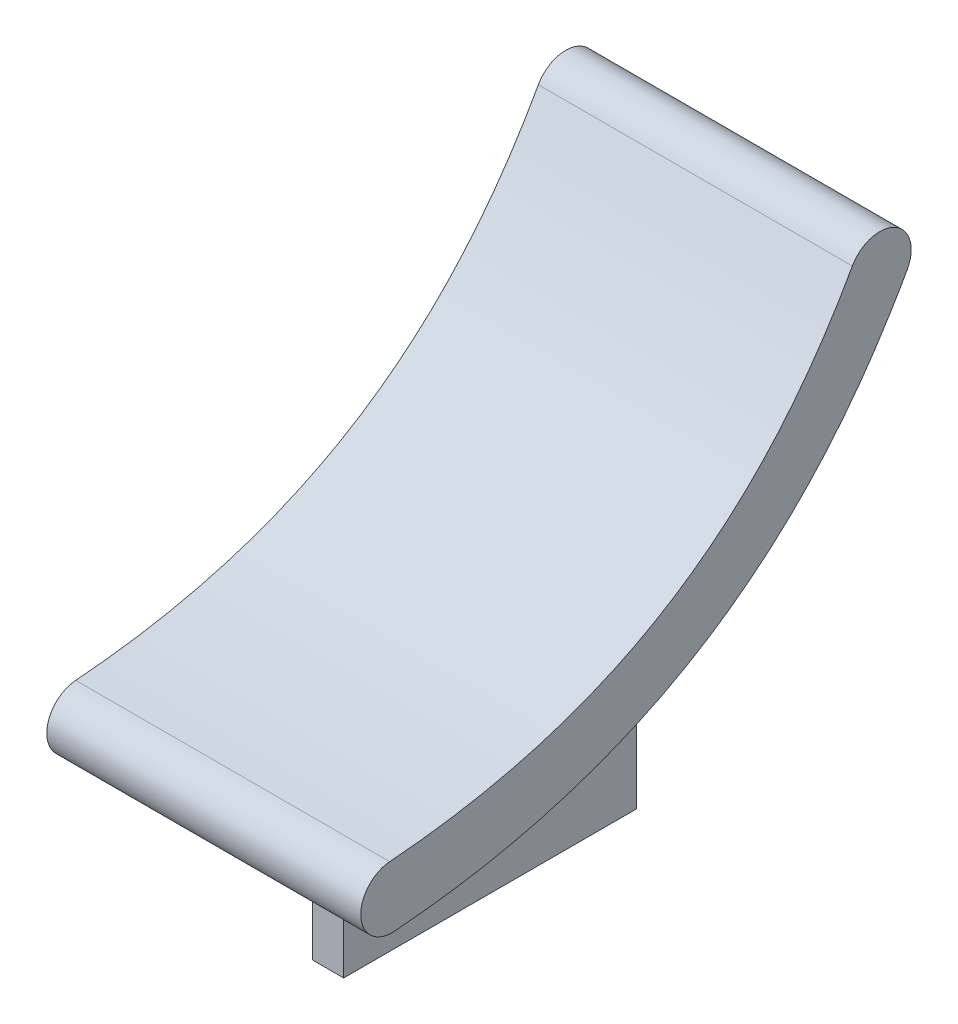
ISO-10303-21;
HEADER;
FILE_DESCRIPTION(('STEP AP214'),'2;1');
FILE_NAME('part.step','',(''),(''),'','','');
FILE_SCHEMA(('AUTOMOTIVE_DESIGN { 1 0 10303 214 1 1 1 1 }'));
ENDSEC;
DATA;
#1=APPLICATION_CONTEXT('core data for automotive mechanical design processes');
#2=APPLICATION_PROTOCOL_DEFINITION('international standard','automotive_design',2000,#1);
#3=PRODUCT_CONTEXT('',#1,'mechanical');
#4=PRODUCT('Part','Part','',(#3));
#5=PRODUCT_RELATED_PRODUCT_CATEGORY('part','',(#4));
#6=PRODUCT_DEFINITION_FORMATION('','',#4);
#7=PRODUCT_DEFINITION_CONTEXT('part definition',#1,'design');
#8=PRODUCT_DEFINITION('design','',#6,#7);
#9=PRODUCT_DEFINITION_SHAPE('','',#8);
#10=(LENGTH_UNIT() NAMED_UNIT(*) SI_UNIT(.MILLI.,.METRE.));
#11=(NAMED_UNIT(*) PLANE_ANGLE_UNIT() SI_UNIT($,.RADIAN.));
#12=(NAMED_UNIT(*) SI_UNIT($,.STERADIAN.) SOLID_ANGLE_UNIT());
#13=UNCERTAINTY_MEASURE_WITH_UNIT(LENGTH_MEASURE(1.E-05),#10,'distance_accuracy_value','');
#14=(GEOMETRIC_REPRESENTATION_CONTEXT(3) GLOBAL_UNCERTAINTY_ASSIGNED_CONTEXT((#13)) GLOBAL_UNIT_ASSIGNED_CONTEXT((#10,
#11,#12)) REPRESENTATION_CONTEXT('',''));
#15=CARTESIAN_POINT('',(0.,0.,0.));
#16=DIRECTION('',(0.,0.,1.));
#17=DIRECTION('',(1.,0.,0.));
#18=AXIS2_PLACEMENT_3D('',#15,#16,#17);
#19=CARTESIAN_POINT('',(0.75,0.,-14.));
#20=DIRECTION('',(0.,0.,1.));
#21=DIRECTION('',(1.,0.,0.));
#22=AXIS2_PLACEMENT_3D('',#19,#20,#21);
#23=PLANE('',#22);
#24=DIRECTION('',(-1.,0.,0.));
#25=VECTOR('',#24,1.);
#26=CARTESIAN_POINT('',(7.5,14.6557179824712,-14.));
#27=LINE('',#26,#25);
#28=CARTESIAN_POINT('',(0.75,14.6557179824712,-14.));
#29=VERTEX_POINT('',#28);
#30=CARTESIAN_POINT('',(-0.75,14.6557179891717,-14.));
#31=VERTEX_POINT('',#30);
#32=EDGE_CURVE('E54',#29,#31,#27,.T.);
#33=ORIENTED_EDGE('',*,*,#32,.F.);
#34=DIRECTION('',(0.,1.,0.));
#35=VECTOR('',#34,1.);
#36=CARTESIAN_POINT('',(0.75,0.,-14.));
#37=LINE('',#36,#35);
#38=CARTESIAN_POINT('',(0.75,0.,-14.));
#39=VERTEX_POINT('',#38);
#40=EDGE_CURVE('E164',#39,#29,#37,.T.);
#41=ORIENTED_EDGE('',*,*,#40,.F.);
#42=DIRECTION('',(-1.,0.,0.));
#43=VECTOR('',#42,1.);
#44=CARTESIAN_POINT('',(0.75,0.,-14.));
#45=LINE('',#44,#43);
#46=CARTESIAN_POINT('',(-0.75,0.,-14.));
#47=VERTEX_POINT('',#46);
#48=EDGE_CURVE('E178',#39,#47,#45,.T.);
#49=ORIENTED_EDGE('',*,*,#48,.T.);
#50=DIRECTION('',(0.,1.,0.));
#51=VECTOR('',#50,1.);
#52=CARTESIAN_POINT('',(-0.75,0.,-14.));
#53=LINE('',#52,#51);
#54=EDGE_CURVE('E173',#47,#31,#53,.T.);
#55=ORIENTED_EDGE('',*,*,#54,.T.);
#56=EDGE_LOOP('',(#33,#41,#49,#55));
#57=FACE_BOUND('',#56,.T.);
#58=ADVANCED_FACE('F37',(#57),#23,.F.);
#59=CARTESIAN_POINT('',(0.75,8.,0.));
#60=DIRECTION('',(0.,-0.813733471206735,-0.581238193719096));
#61=DIRECTION('',(0.,0.581238193719096,-0.813733471206735));
#62=AXIS2_PLACEMENT_3D('',#59,#60,#61);
#63=PLANE('',#62);
#64=DIRECTION('',(-1.,0.,0.));
#65=VECTOR('',#64,1.);
#66=CARTESIAN_POINT('',(7.5,8.04212169429466,-0.0589703720125291));
#67=LINE('',#66,#65);
#68=CARTESIAN_POINT('',(-0.750000000000001,8.04212169432211,-0.0589703721595343));
#69=VERTEX_POINT('',#68);
#70=CARTESIAN_POINT('',(0.75,8.04212169429466,-0.0589703720125291));
#71=VERTEX_POINT('',#70);
#72=EDGE_CURVE('E145',#69,#71,#67,.F.);
#73=ORIENTED_EDGE('',*,*,#72,.F.);
#74=DIRECTION('',(0.,-0.581238193719096,0.813733471206735));
#75=VECTOR('',#74,1.);
#76=CARTESIAN_POINT('',(-0.75,8.,0.));
#77=LINE('',#76,#75);
#78=CARTESIAN_POINT('',(-0.75,8.,0.));
#79=VERTEX_POINT('',#78);
#80=EDGE_CURVE('E80',#69,#79,#77,.T.);
#81=ORIENTED_EDGE('',*,*,#80,.T.);
#82=DIRECTION('',(-1.,0.,0.));
#83=VECTOR('',#82,1.);
#84=CARTESIAN_POINT('',(0.75,8.,0.));
#85=LINE('',#84,#83);
#86=CARTESIAN_POINT('',(0.75,8.,0.));
#87=VERTEX_POINT('',#86);
#88=EDGE_CURVE('E168',#87,#79,#85,.T.);
#89=ORIENTED_EDGE('',*,*,#88,.F.);
#90=DIRECTION('',(0.,-0.581238193719096,0.813733471206735));
#91=VECTOR('',#90,1.);
#92=CARTESIAN_POINT('',(0.75,8.,0.));
#93=LINE('',#92,#91);
#94=EDGE_CURVE('E62',#71,#87,#93,.T.);
#95=ORIENTED_EDGE('',*,*,#94,.F.);
#96=EDGE_LOOP('',(#73,#81,#89,#95));
#97=FACE_BOUND('',#96,.T.);
#98=ADVANCED_FACE('F191',(#97),#63,.F.);
#99=CARTESIAN_POINT('',(0.75,0.,0.));
#100=DIRECTION('',(-1.,0.,0.));
#101=DIRECTION('',(0.,0.,1.));
#102=AXIS2_PLACEMENT_3D('',#99,#100,#101);
#103=PLANE('',#102);
#104=CARTESIAN_POINT('',(0.75,7.47346360448327,4.31582586408039));
#105=CARTESIAN_POINT('',(0.75,7.53089771312277,3.58324313116291));
#106=CARTESIAN_POINT('',(0.75,7.68322369993459,2.10058504292155));
#107=CARTESIAN_POINT('',(0.75,8.11834038428582,-0.685763790486934));
#108=CARTESIAN_POINT('',(0.75,8.91718557126412,-3.95690223313834));
#109=CARTESIAN_POINT('',(0.75,10.2824812313227,-7.52072719484049));
#110=CARTESIAN_POINT('',(0.75,12.0486944848316,-10.7361288460705));
#111=CARTESIAN_POINT('',(0.75,14.1936585184877,-13.5992952282166));
#112=CARTESIAN_POINT('',(0.75,16.6867510313363,-16.119096641378));
#113=CARTESIAN_POINT('',(0.75,19.4776224779367,-18.3090623200747));
#114=CARTESIAN_POINT('',(0.75,21.5457509763938,-19.5886896301993));
#115=CARTESIAN_POINT('',(0.75,22.5991105018175,-20.1741870613612));
#116=B_SPLINE_CURVE_WITH_KNOTS('',3,(#104,#105,#106,#107,#108,#109,#110,#111,#112,#113,#114,
#115),.UNSPECIFIED.,.F.,.F.,(4,1,1,1,1,1,1,1,1,4),(0.,0.0625,0.125,0.25,0.375,0.5,0.625,0.75,
0.875,1.),.UNSPECIFIED.);
#117=EDGE_CURVE('E153',#71,#29,#116,.T.);
#118=ORIENTED_EDGE('',*,*,#117,.F.);
#119=ORIENTED_EDGE('',*,*,#94,.T.);
#120=DIRECTION('',(0.,-1.,0.));
#121=VECTOR('',#120,1.);
#122=CARTESIAN_POINT('',(0.75,0.,0.));
#123=LINE('',#122,#121);
#124=CARTESIAN_POINT('',(0.75,0.,0.));
#125=VERTEX_POINT('',#124);
#126=EDGE_CURVE('E158',#87,#125,#123,.T.);
#127=ORIENTED_EDGE('',*,*,#126,.T.);
#128=DIRECTION('',(0.,0.,-1.));
#129=VECTOR('',#128,1.);
#130=CARTESIAN_POINT('',(0.75,0.,0.));
#131=LINE('',#130,#129);
#132=EDGE_CURVE('E86',#125,#39,#131,.T.);
#133=ORIENTED_EDGE('',*,*,#132,.T.);
#134=ORIENTED_EDGE('',*,*,#40,.T.);
#135=EDGE_LOOP('',(#118,#119,#127,#133,#134));
#136=FACE_BOUND('',#135,.T.);
#137=ADVANCED_FACE('F190',(#136),#103,.F.);
#138=CARTESIAN_POINT('',(-0.75,0.,0.));
#139=DIRECTION('',(-1.,0.,0.));
#140=DIRECTION('',(0.,0.,1.));
#141=AXIS2_PLACEMENT_3D('',#138,#139,#140);
#142=PLANE('',#141);
#143=ORIENTED_EDGE('',*,*,#80,.F.);
#144=CARTESIAN_POINT('',(-0.750000000000001,7.47346360448327,4.31582586408039));
#145=CARTESIAN_POINT('',(-0.750000000000001,7.53089771312277,3.58324313116291));
#146=CARTESIAN_POINT('',(-0.750000000000001,7.68322369993459,2.10058504292155));
#147=CARTESIAN_POINT('',(-0.750000000000001,8.11834038428582,-0.685763790486934));
#148=CARTESIAN_POINT('',(-0.750000000000001,8.91718557126412,-3.95690223313834));
#149=CARTESIAN_POINT('',(-0.750000000000001,10.2824812313227,-7.52072719484049));
#150=CARTESIAN_POINT('',(-0.750000000000001,12.0486944848316,-10.7361288460705));
#151=CARTESIAN_POINT('',(-0.750000000000001,14.1936585184877,-13.5992952282166));
#152=CARTESIAN_POINT('',(-0.750000000000001,16.6867510313363,-16.119096641378));
#153=CARTESIAN_POINT('',(-0.750000000000001,19.4776224779367,-18.3090623200747));
#154=CARTESIAN_POINT('',(-0.750000000000001,21.5457509763938,-19.5886896301993));
#155=CARTESIAN_POINT('',(-0.750000000000001,22.5991105018175,-20.1741870613612));
#156=B_SPLINE_CURVE_WITH_KNOTS('',3,(#144,#145,#146,#147,#148,#149,#150,#151,#152,#153,#154,
#155),.UNSPECIFIED.,.F.,.F.,(4,1,1,1,1,1,1,1,1,4),(0.,0.0625,0.125,0.25,0.375,0.5,0.625,0.75,
0.875,1.),.UNSPECIFIED.);
#157=EDGE_CURVE('E11',#69,#31,#156,.T.);
#158=ORIENTED_EDGE('',*,*,#157,.T.);
#159=ORIENTED_EDGE('',*,*,#54,.F.);
#160=DIRECTION('',(0.,0.,-1.));
#161=VECTOR('',#160,1.);
#162=CARTESIAN_POINT('',(-0.75,0.,0.));
#163=LINE('',#162,#161);
#164=CARTESIAN_POINT('',(-0.75,0.,0.));
#165=VERTEX_POINT('',#164);
#166=EDGE_CURVE('E171',#165,#47,#163,.T.);
#167=ORIENTED_EDGE('',*,*,#166,.F.);
#168=DIRECTION('',(0.,-1.,0.));
#169=VECTOR('',#168,1.);
#170=CARTESIAN_POINT('',(-0.75,0.,0.));
#171=LINE('',#170,#169);
#172=EDGE_CURVE('E157',#79,#165,#171,.T.);
#173=ORIENTED_EDGE('',*,*,#172,.F.);
#174=EDGE_LOOP('',(#143,#158,#159,#167,#173));
#175=FACE_BOUND('',#174,.T.);
#176=ADVANCED_FACE('F186',(#175),#142,.T.);
#177=CARTESIAN_POINT('',(0.75,0.,0.));
#178=DIRECTION('',(0.,0.,-1.));
#179=DIRECTION('',(-1.,0.,0.));
#180=AXIS2_PLACEMENT_3D('',#177,#178,#179);
#181=PLANE('',#180);
#182=ORIENTED_EDGE('',*,*,#172,.T.);
#183=DIRECTION('',(-1.,0.,0.));
#184=VECTOR('',#183,1.);
#185=CARTESIAN_POINT('',(0.75,0.,0.));
#186=LINE('',#185,#184);
#187=EDGE_CURVE('E47',#125,#165,#186,.T.);
#188=ORIENTED_EDGE('',*,*,#187,.F.);
#189=ORIENTED_EDGE('',*,*,#126,.F.);
#190=ORIENTED_EDGE('',*,*,#88,.T.);
#191=EDGE_LOOP('',(#182,#188,#189,#190));
#192=FACE_BOUND('',#191,.T.);
#193=ADVANCED_FACE('F39',(#192),#181,.F.);
#194=CARTESIAN_POINT('',(0.75,0.,0.));
#195=DIRECTION('',(0.,1.,0.));
#196=DIRECTION('',(0.,0.,1.));
#197=AXIS2_PLACEMENT_3D('',#194,#195,#196);
#198=PLANE('',#197);
#199=ORIENTED_EDGE('',*,*,#166,.T.);
#200=ORIENTED_EDGE('',*,*,#48,.F.);
#201=ORIENTED_EDGE('',*,*,#132,.F.);
#202=ORIENTED_EDGE('',*,*,#187,.T.);
#203=EDGE_LOOP('',(#199,#200,#201,#202));
#204=FACE_BOUND('',#203,.T.);
#205=ADVANCED_FACE('F181',(#204),#198,.F.);
#206=CARTESIAN_POINT('',(7.5,7.47346360448327,4.31582586408039));
#207=CARTESIAN_POINT('',(7.5,7.53089771312277,3.58324313116291));
#208=CARTESIAN_POINT('',(7.5,7.68322369993459,2.10058504292155));
#209=CARTESIAN_POINT('',(7.5,8.11834038428582,-0.685763790486934));
#210=CARTESIAN_POINT('',(7.5,8.91718557126412,-3.95690223313834));
#211=CARTESIAN_POINT('',(7.5,10.2824812313227,-7.52072719484049));
#212=CARTESIAN_POINT('',(7.5,12.0486944848316,-10.7361288460705));
#213=CARTESIAN_POINT('',(7.5,14.1936585184877,-13.5992952282166));
#214=CARTESIAN_POINT('',(7.5,16.6867510313363,-16.119096641378));
#215=CARTESIAN_POINT('',(7.5,19.4776224779367,-18.3090623200747));
#216=CARTESIAN_POINT('',(7.5,21.5457509763938,-19.5886896301993));
#217=CARTESIAN_POINT('',(7.5,22.5991105018175,-20.1741870613612));
#218=B_SPLINE_CURVE_WITH_KNOTS('',3,(#206,#207,#208,#209,#210,#211,#212,#213,#214,#215,#216,
#217),.UNSPECIFIED.,.F.,.F.,(4,1,1,1,1,1,1,1,1,4),(0.,0.0625,0.125,0.25,0.375,0.5,0.625,0.75,
0.875,1.),.UNSPECIFIED.);
#219=DIRECTION('',(-1.,0.,0.));
#220=VECTOR('',#219,1.);
#221=SURFACE_OF_LINEAR_EXTRUSION('',#218,#220);
#222=CARTESIAN_POINT('',(-7.5,7.47346360448327,4.31582586408039));
#223=CARTESIAN_POINT('',(-7.5,7.53089771312277,3.58324313116291));
#224=CARTESIAN_POINT('',(-7.5,7.68322369993459,2.10058504292155));
#225=CARTESIAN_POINT('',(-7.5,8.11834038428582,-0.685763790486934));
#226=CARTESIAN_POINT('',(-7.5,8.91718557126412,-3.95690223313834));
#227=CARTESIAN_POINT('',(-7.5,10.2824812313227,-7.52072719484049));
#228=CARTESIAN_POINT('',(-7.5,12.0486944848316,-10.7361288460705));
#229=CARTESIAN_POINT('',(-7.5,14.1936585184877,-13.5992952282166));
#230=CARTESIAN_POINT('',(-7.5,16.6867510313363,-16.119096641378));
#231=CARTESIAN_POINT('',(-7.5,19.4776224779367,-18.3090623200747));
#232=CARTESIAN_POINT('',(-7.5,21.5457509763938,-19.5886896301993));
#233=CARTESIAN_POINT('',(-7.5,22.5991105018175,-20.1741870613612));
#234=B_SPLINE_CURVE_WITH_KNOTS('',3,(#222,#223,#224,#225,#226,#227,#228,#229,#230,#231,#232,
#233),.UNSPECIFIED.,.F.,.F.,(4,1,1,1,1,1,1,1,1,4),(0.,0.0625,0.125,0.25,0.375,0.5,0.625,0.75,
0.875,1.),.UNSPECIFIED.);
#235=CARTESIAN_POINT('',(-7.5,7.47346360448327,4.31582586408039));
#236=VERTEX_POINT('',#235);
#237=CARTESIAN_POINT('',(-7.5,22.5991105018175,-20.1741870613612));
#238=VERTEX_POINT('',#237);
#239=EDGE_CURVE('E237',#236,#238,#234,.T.);
#240=ORIENTED_EDGE('',*,*,#239,.T.);
#241=DIRECTION('',(-1.,0.,0.));
#242=VECTOR('',#241,1.);
#243=CARTESIAN_POINT('',(7.5,22.5991105018175,-20.1741870613612));
#244=LINE('',#243,#242);
#245=CARTESIAN_POINT('',(7.5,22.5991105018175,-20.1741870613612));
#246=VERTEX_POINT('',#245);
#247=EDGE_CURVE('E148',#246,#238,#244,.T.);
#248=ORIENTED_EDGE('',*,*,#247,.F.);
#249=CARTESIAN_POINT('',(7.5,7.47346360448327,4.31582586408039));
#250=VERTEX_POINT('',#249);
#251=EDGE_CURVE('E130',#250,#246,#218,.T.);
#252=ORIENTED_EDGE('',*,*,#251,.F.);
#253=DIRECTION('',(-1.,0.,0.));
#254=VECTOR('',#253,1.);
#255=CARTESIAN_POINT('',(7.5,7.47346360448327,4.31582586408039));
#256=LINE('',#255,#254);
#257=EDGE_CURVE('E127',#250,#236,#256,.T.);
#258=ORIENTED_EDGE('',*,*,#257,.T.);
#259=EDGE_LOOP('',(#240,#248,#252,#258));
#260=FACE_BOUND('',#259,.T.);
#261=ORIENTED_EDGE('',*,*,#72,.T.);
#262=ORIENTED_EDGE('',*,*,#117,.T.);
#263=ORIENTED_EDGE('',*,*,#32,.T.);
#264=ORIENTED_EDGE('',*,*,#157,.F.);
#265=EDGE_LOOP('',(#261,#262,#263,#264));
#266=FACE_BOUND('',#265,.T.);
#267=ADVANCED_FACE('F192',(#260,#266),#221,.F.);
#268=CARTESIAN_POINT('',(7.5,24.0566055430731,-17.5520298950732));
#269=CARTESIAN_POINT('',(7.5,16.1772398727277,-13.1723776986239));
#270=CARTESIAN_POINT('',(7.5,11.3414188760467,-6.63768590619089));
#271=CARTESIAN_POINT('',(7.5,10.4642861707958,4.55030481161301));
#272=B_SPLINE_CURVE_WITH_KNOTS('',3,(#268,#269,#270,#271),.UNSPECIFIED.,.F.,.F.,(4,4),(0.,1.),.UNSPECIFIED.);
#273=DIRECTION('',(-1.,0.,0.));
#274=VECTOR('',#273,1.);
#275=SURFACE_OF_LINEAR_EXTRUSION('',#272,#274);
#276=CARTESIAN_POINT('',(-7.5,24.0566055430731,-17.5520298950732));
#277=CARTESIAN_POINT('',(-7.5,16.1772398727277,-13.1723776986239));
#278=CARTESIAN_POINT('',(-7.5,11.3414188760467,-6.63768590619089));
#279=CARTESIAN_POINT('',(-7.5,10.4642861707958,4.55030481161301));
#280=B_SPLINE_CURVE_WITH_KNOTS('',3,(#276,#277,#278,#279),.UNSPECIFIED.,.F.,.F.,(4,4),(0.,1.),.UNSPECIFIED.);
#281=CARTESIAN_POINT('',(-7.5,24.0566055430731,-17.5520298950732));
#282=VERTEX_POINT('',#281);
#283=CARTESIAN_POINT('',(-7.5,10.4642861707958,4.55030481161301));
#284=VERTEX_POINT('',#283);
#285=EDGE_CURVE('E144',#282,#284,#280,.T.);
#286=ORIENTED_EDGE('',*,*,#285,.T.);
#287=DIRECTION('',(-1.,0.,0.));
#288=VECTOR('',#287,1.);
#289=CARTESIAN_POINT('',(7.5,10.4642861707958,4.55030481161301));
#290=LINE('',#289,#288);
#291=CARTESIAN_POINT('',(7.5,10.4642861707958,4.55030481161301));
#292=VERTEX_POINT('',#291);
#293=EDGE_CURVE('E124',#292,#284,#290,.T.);
#294=ORIENTED_EDGE('',*,*,#293,.F.);
#295=CARTESIAN_POINT('',(7.5,24.0566055430731,-17.5520298950732));
#296=VERTEX_POINT('',#295);
#297=EDGE_CURVE('E131',#296,#292,#272,.T.);
#298=ORIENTED_EDGE('',*,*,#297,.F.);
#299=DIRECTION('',(-1.,0.,0.));
#300=VECTOR('',#299,1.);
#301=CARTESIAN_POINT('',(7.5,24.0566055430731,-17.5520298950732));
#302=LINE('',#301,#300);
#303=EDGE_CURVE('E228',#296,#282,#302,.T.);
#304=ORIENTED_EDGE('',*,*,#303,.T.);
#305=EDGE_LOOP('',(#286,#294,#298,#304));
#306=FACE_BOUND('',#305,.T.);
#307=ADVANCED_FACE('F142',(#306),#275,.F.);
#308=CARTESIAN_POINT('',(7.5,8.96887488763952,4.4330653378467));
#309=DIRECTION('',(-1.,0.,0.));
#310=DIRECTION('',(0.,0.,1.));
#311=AXIS2_PLACEMENT_3D('',#308,#309,#310);
#312=CYLINDRICAL_SURFACE('',#311,1.5);
#313=CARTESIAN_POINT('',(-7.5,8.96887488763952,4.4330653378467));
#314=DIRECTION('',(1.,0.,0.));
#315=DIRECTION('',(0.,0.,-1.));
#316=AXIS2_PLACEMENT_3D('',#313,#314,#315);
#317=CIRCLE('',#316,1.5);
#318=EDGE_CURVE('E232',#284,#236,#317,.T.);
#319=ORIENTED_EDGE('',*,*,#318,.T.);
#320=ORIENTED_EDGE('',*,*,#257,.F.);
#321=CARTESIAN_POINT('',(7.5,8.96887488763952,4.4330653378467));
#322=DIRECTION('',(1.,0.,0.));
#323=DIRECTION('',(0.,0.,-1.));
#324=AXIS2_PLACEMENT_3D('',#321,#322,#323);
#325=CIRCLE('',#324,1.5);
#326=EDGE_CURVE('E120',#292,#250,#325,.T.);
#327=ORIENTED_EDGE('',*,*,#326,.F.);
#328=ORIENTED_EDGE('',*,*,#293,.T.);
#329=EDGE_LOOP('',(#319,#320,#327,#328));
#330=FACE_BOUND('',#329,.T.);
#331=ADVANCED_FACE('F122',(#330),#312,.T.);
#332=CARTESIAN_POINT('',(7.5,23.3278580224453,-18.8631084782172));
#333=DIRECTION('',(-1.,0.,0.));
#334=DIRECTION('',(0.,0.,1.));
#335=AXIS2_PLACEMENT_3D('',#332,#333,#334);
#336=CYLINDRICAL_SURFACE('',#335,1.5);
#337=CARTESIAN_POINT('',(-7.5,23.3278580224453,-18.8631084782172));
#338=DIRECTION('',(1.,0.,0.));
#339=DIRECTION('',(0.,0.,1.));
#340=AXIS2_PLACEMENT_3D('',#337,#338,#339);
#341=CIRCLE('',#340,1.5);
#342=EDGE_CURVE('E140',#238,#282,#341,.T.);
#343=ORIENTED_EDGE('',*,*,#342,.T.);
#344=ORIENTED_EDGE('',*,*,#303,.F.);
#345=CARTESIAN_POINT('',(7.5,23.3278580224453,-18.8631084782172));
#346=DIRECTION('',(1.,0.,0.));
#347=DIRECTION('',(0.,0.,1.));
#348=AXIS2_PLACEMENT_3D('',#345,#346,#347);
#349=CIRCLE('',#348,1.5);
#350=EDGE_CURVE('E136',#246,#296,#349,.T.);
#351=ORIENTED_EDGE('',*,*,#350,.F.);
#352=ORIENTED_EDGE('',*,*,#247,.T.);
#353=EDGE_LOOP('',(#343,#344,#351,#352));
#354=FACE_BOUND('',#353,.T.);
#355=ADVANCED_FACE('F249',(#354),#336,.T.);
#356=CARTESIAN_POINT('',(7.5,14.634608495024,-9.05398948723809));
#357=DIRECTION('',(-1.,0.,0.));
#358=DIRECTION('',(0.,0.,1.));
#359=AXIS2_PLACEMENT_3D('',#356,#357,#358);
#360=PLANE('',#359);
#361=ORIENTED_EDGE('',*,*,#297,.T.);
#362=ORIENTED_EDGE('',*,*,#326,.T.);
#363=ORIENTED_EDGE('',*,*,#251,.T.);
#364=ORIENTED_EDGE('',*,*,#350,.T.);
#365=EDGE_LOOP('',(#361,#362,#363,#364));
#366=FACE_BOUND('',#365,.T.);
#367=ADVANCED_FACE('F134',(#366),#360,.F.);
#368=CARTESIAN_POINT('',(-7.5,14.634608495024,-9.05398948723809));
#369=DIRECTION('',(-1.,0.,0.));
#370=DIRECTION('',(0.,0.,1.));
#371=AXIS2_PLACEMENT_3D('',#368,#369,#370);
#372=PLANE('',#371);
#373=ORIENTED_EDGE('',*,*,#285,.F.);
#374=ORIENTED_EDGE('',*,*,#342,.F.);
#375=ORIENTED_EDGE('',*,*,#239,.F.);
#376=ORIENTED_EDGE('',*,*,#318,.F.);
#377=EDGE_LOOP('',(#373,#374,#375,#376));
#378=FACE_BOUND('',#377,.T.);
#379=ADVANCED_FACE('F252',(#378),#372,.T.);
#380=CLOSED_SHELL('',(#58,#98,#137,#176,#193,#205,#267,#307,#331,#355,#367,#379));
#381=MANIFOLD_SOLID_BREP('B2',#380);
#382=ADVANCED_BREP_SHAPE_REPRESENTATION('',(#18,#381),#14);
#383=SHAPE_DEFINITION_REPRESENTATION(#9,#382);
ENDSEC;
END-ISO-10303-21;
